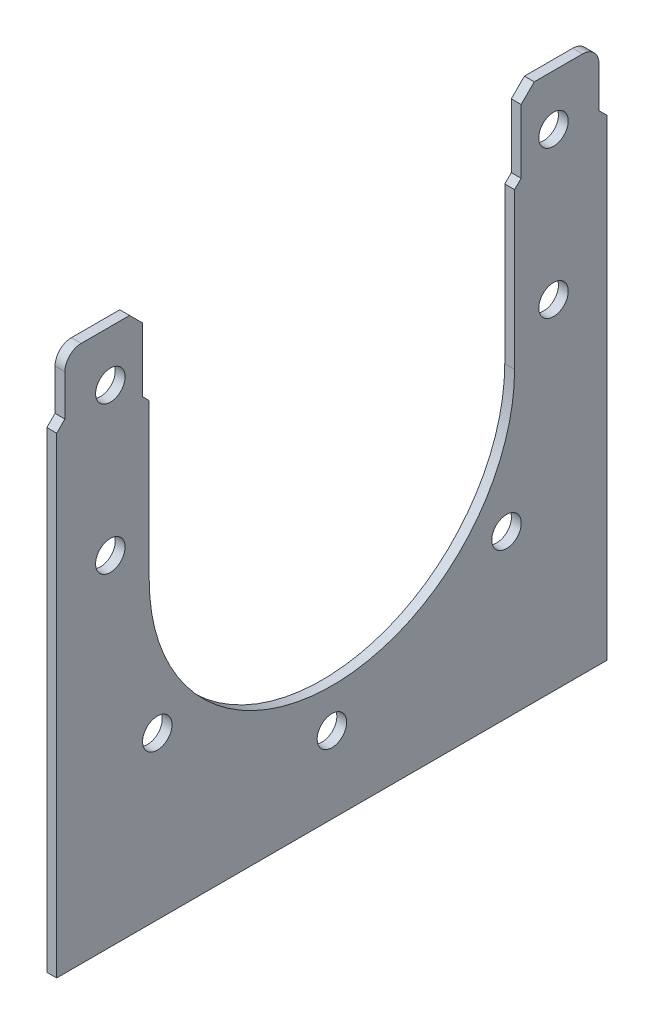
ISO-10303-21;
HEADER;
FILE_DESCRIPTION(('STEP AP214'),'2;1');
FILE_NAME('part.step','',(''),(''),'','','');
FILE_SCHEMA(('AUTOMOTIVE_DESIGN { 1 0 10303 214 1 1 1 1 }'));
ENDSEC;
DATA;
#1=APPLICATION_CONTEXT('core data for automotive mechanical design processes');
#2=APPLICATION_PROTOCOL_DEFINITION('international standard','automotive_design',2000,#1);
#3=PRODUCT_CONTEXT('',#1,'mechanical');
#4=PRODUCT('Part','Part','',(#3));
#5=PRODUCT_RELATED_PRODUCT_CATEGORY('part','',(#4));
#6=PRODUCT_DEFINITION_FORMATION('','',#4);
#7=PRODUCT_DEFINITION_CONTEXT('part definition',#1,'design');
#8=PRODUCT_DEFINITION('design','',#6,#7);
#9=PRODUCT_DEFINITION_SHAPE('','',#8);
#10=(LENGTH_UNIT() NAMED_UNIT(*) SI_UNIT(.MILLI.,.METRE.));
#11=(NAMED_UNIT(*) PLANE_ANGLE_UNIT() SI_UNIT($,.RADIAN.));
#12=(NAMED_UNIT(*) SI_UNIT($,.STERADIAN.) SOLID_ANGLE_UNIT());
#13=UNCERTAINTY_MEASURE_WITH_UNIT(LENGTH_MEASURE(1.E-05),#10,'distance_accuracy_value','');
#14=(GEOMETRIC_REPRESENTATION_CONTEXT(3) GLOBAL_UNCERTAINTY_ASSIGNED_CONTEXT((#13)) GLOBAL_UNIT_ASSIGNED_CONTEXT((#10,
#11,#12)) REPRESENTATION_CONTEXT('',''));
#15=CARTESIAN_POINT('',(0.,0.,0.));
#16=DIRECTION('',(0.,0.,1.));
#17=DIRECTION('',(1.,0.,0.));
#18=AXIS2_PLACEMENT_3D('',#15,#16,#17);
#19=CARTESIAN_POINT('',(-3.,146.,168.));
#20=DIRECTION('',(0.,1.,0.));
#21=DIRECTION('',(0.,0.,1.));
#22=AXIS2_PLACEMENT_3D('',#19,#20,#21);
#23=PLANE('',#22);
#24=DIRECTION('',(0.,0.,1.));
#25=VECTOR('',#24,1.);
#26=CARTESIAN_POINT('',(3.,146.,168.));
#27=LINE('',#26,#25);
#28=CARTESIAN_POINT('',(3.,146.,123.5));
#29=VERTEX_POINT('',#28);
#30=CARTESIAN_POINT('',(3.,146.,153.));
#31=VERTEX_POINT('',#30);
#32=EDGE_CURVE('E335',#29,#31,#27,.T.);
#33=ORIENTED_EDGE('',*,*,#32,.F.);
#34=DIRECTION('',(-1.,0.,0.));
#35=VECTOR('',#34,1.);
#36=CARTESIAN_POINT('',(-3.,146.,123.5));
#37=LINE('',#36,#35);
#38=CARTESIAN_POINT('',(-3.,146.,123.5));
#39=VERTEX_POINT('',#38);
#40=EDGE_CURVE('E208',#29,#39,#37,.T.);
#41=ORIENTED_EDGE('',*,*,#40,.T.);
#42=DIRECTION('',(0.,0.,1.));
#43=VECTOR('',#42,1.);
#44=CARTESIAN_POINT('',(-3.,146.,168.));
#45=LINE('',#44,#43);
#46=CARTESIAN_POINT('',(-3.,146.,153.));
#47=VERTEX_POINT('',#46);
#48=EDGE_CURVE('E339',#39,#47,#45,.T.);
#49=ORIENTED_EDGE('',*,*,#48,.T.);
#50=DIRECTION('',(1.,0.,0.));
#51=VECTOR('',#50,1.);
#52=CARTESIAN_POINT('',(3.,146.,153.));
#53=LINE('',#52,#51);
#54=EDGE_CURVE('E426',#47,#31,#53,.T.);
#55=ORIENTED_EDGE('',*,*,#54,.T.);
#56=EDGE_LOOP('',(#33,#41,#49,#55));
#57=FACE_BOUND('',#56,.T.);
#58=ADVANCED_FACE('F53',(#57),#23,.T.);
#59=CARTESIAN_POINT('',(-3.,0.,111.5));
#60=DIRECTION('',(0.,0.,-1.));
#61=DIRECTION('',(-1.,0.,0.));
#62=AXIS2_PLACEMENT_3D('',#59,#60,#61);
#63=PLANE('',#62);
#64=DIRECTION('',(0.,1.,0.));
#65=VECTOR('',#64,1.);
#66=CARTESIAN_POINT('',(-3.,0.,111.5));
#67=LINE('',#66,#65);
#68=CARTESIAN_POINT('',(-3.,0.,111.5));
#69=VERTEX_POINT('',#68);
#70=CARTESIAN_POINT('',(-3.,95.,111.5));
#71=VERTEX_POINT('',#70);
#72=EDGE_CURVE('E364',#69,#71,#67,.T.);
#73=ORIENTED_EDGE('',*,*,#72,.T.);
#74=DIRECTION('',(1.,0.,0.));
#75=VECTOR('',#74,1.);
#76=CARTESIAN_POINT('',(3.,95.,111.5));
#77=LINE('',#76,#75);
#78=CARTESIAN_POINT('',(3.,95.,111.5));
#79=VERTEX_POINT('',#78);
#80=EDGE_CURVE('E11',#71,#79,#77,.T.);
#81=ORIENTED_EDGE('',*,*,#80,.T.);
#82=DIRECTION('',(0.,1.,0.));
#83=VECTOR('',#82,1.);
#84=CARTESIAN_POINT('',(3.,0.,111.5));
#85=LINE('',#84,#83);
#86=CARTESIAN_POINT('',(3.,0.,111.5));
#87=VERTEX_POINT('',#86);
#88=EDGE_CURVE('E202',#87,#79,#85,.T.);
#89=ORIENTED_EDGE('',*,*,#88,.F.);
#90=DIRECTION('',(1.,0.,0.));
#91=VECTOR('',#90,1.);
#92=CARTESIAN_POINT('',(-3.,0.,111.5));
#93=LINE('',#92,#91);
#94=EDGE_CURVE('E393',#69,#87,#93,.T.);
#95=ORIENTED_EDGE('',*,*,#94,.F.);
#96=EDGE_LOOP('',(#73,#81,#89,#95));
#97=FACE_BOUND('',#96,.T.);
#98=ADVANCED_FACE('F480',(#97),#63,.T.);
#99=CARTESIAN_POINT('',(-3.,0.,0.));
#100=DIRECTION('',(1.,0.,0.));
#101=DIRECTION('',(0.,0.,-1.));
#102=AXIS2_PLACEMENT_3D('',#99,#100,#101);
#103=CYLINDRICAL_SURFACE('',#102,111.5);
#104=CARTESIAN_POINT('',(3.,0.,0.));
#105=DIRECTION('',(-1.,0.,0.));
#106=DIRECTION('',(0.,0.,-1.));
#107=AXIS2_PLACEMENT_3D('',#104,#105,#106);
#108=CIRCLE('',#107,111.5);
#109=CARTESIAN_POINT('',(3.,0.,-111.5));
#110=VERTEX_POINT('',#109);
#111=EDGE_CURVE('E388',#110,#87,#108,.T.);
#112=ORIENTED_EDGE('',*,*,#111,.F.);
#113=DIRECTION('',(1.,0.,0.));
#114=VECTOR('',#113,1.);
#115=CARTESIAN_POINT('',(-3.,0.,-111.5));
#116=LINE('',#115,#114);
#117=CARTESIAN_POINT('',(-3.,0.,-111.5));
#118=VERTEX_POINT('',#117);
#119=EDGE_CURVE('E397',#118,#110,#116,.T.);
#120=ORIENTED_EDGE('',*,*,#119,.F.);
#121=CARTESIAN_POINT('',(-3.,0.,0.));
#122=DIRECTION('',(-1.,0.,0.));
#123=DIRECTION('',(0.,0.,-1.));
#124=AXIS2_PLACEMENT_3D('',#121,#122,#123);
#125=CIRCLE('',#124,111.5);
#126=EDGE_CURVE('E360',#118,#69,#125,.T.);
#127=ORIENTED_EDGE('',*,*,#126,.T.);
#128=ORIENTED_EDGE('',*,*,#94,.T.);
#129=EDGE_LOOP('',(#112,#120,#127,#128));
#130=FACE_BOUND('',#129,.T.);
#131=ADVANCED_FACE('F478',(#130),#103,.F.);
#132=CARTESIAN_POINT('',(-3.,0.,-111.5));
#133=DIRECTION('',(0.,0.,1.));
#134=DIRECTION('',(1.,0.,0.));
#135=AXIS2_PLACEMENT_3D('',#132,#133,#134);
#136=PLANE('',#135);
#137=DIRECTION('',(0.,-1.,0.));
#138=VECTOR('',#137,1.);
#139=CARTESIAN_POINT('',(3.,0.,-111.5));
#140=LINE('',#139,#138);
#141=CARTESIAN_POINT('',(3.,95.0000000000001,-111.5));
#142=VERTEX_POINT('',#141);
#143=EDGE_CURVE('E385',#142,#110,#140,.T.);
#144=ORIENTED_EDGE('',*,*,#143,.F.);
#145=DIRECTION('',(-1.,0.,0.));
#146=VECTOR('',#145,1.);
#147=CARTESIAN_POINT('',(-3.,95.0000000000001,-111.5));
#148=LINE('',#147,#146);
#149=CARTESIAN_POINT('',(-3.,95.0000000000001,-111.5));
#150=VERTEX_POINT('',#149);
#151=EDGE_CURVE('E78',#142,#150,#148,.T.);
#152=ORIENTED_EDGE('',*,*,#151,.T.);
#153=DIRECTION('',(0.,-1.,0.));
#154=VECTOR('',#153,1.);
#155=CARTESIAN_POINT('',(-3.,0.,-111.5));
#156=LINE('',#155,#154);
#157=EDGE_CURVE('E357',#150,#118,#156,.T.);
#158=ORIENTED_EDGE('',*,*,#157,.T.);
#159=ORIENTED_EDGE('',*,*,#119,.T.);
#160=EDGE_LOOP('',(#144,#152,#158,#159));
#161=FACE_BOUND('',#160,.T.);
#162=ADVANCED_FACE('F474',(#161),#136,.T.);
#163=CARTESIAN_POINT('',(-3.,146.,-111.5));
#164=DIRECTION('',(0.,1.,0.));
#165=DIRECTION('',(0.,0.,1.));
#166=AXIS2_PLACEMENT_3D('',#163,#164,#165);
#167=PLANE('',#166);
#168=DIRECTION('',(0.,0.,1.));
#169=VECTOR('',#168,1.);
#170=CARTESIAN_POINT('',(-3.,146.,-111.5));
#171=LINE('',#170,#169);
#172=CARTESIAN_POINT('',(-3.,146.,-153.));
#173=VERTEX_POINT('',#172);
#174=CARTESIAN_POINT('',(-3.,146.,-123.5));
#175=VERTEX_POINT('',#174);
#176=EDGE_CURVE('E353',#173,#175,#171,.T.);
#177=ORIENTED_EDGE('',*,*,#176,.T.);
#178=DIRECTION('',(1.,0.,0.));
#179=VECTOR('',#178,1.);
#180=CARTESIAN_POINT('',(3.,146.,-123.5));
#181=LINE('',#180,#179);
#182=CARTESIAN_POINT('',(3.,146.,-123.5));
#183=VERTEX_POINT('',#182);
#184=EDGE_CURVE('E433',#175,#183,#181,.T.);
#185=ORIENTED_EDGE('',*,*,#184,.T.);
#186=DIRECTION('',(0.,0.,1.));
#187=VECTOR('',#186,1.);
#188=CARTESIAN_POINT('',(3.,146.,-111.5));
#189=LINE('',#188,#187);
#190=CARTESIAN_POINT('',(3.,146.,-153.));
#191=VERTEX_POINT('',#190);
#192=EDGE_CURVE('E381',#191,#183,#189,.T.);
#193=ORIENTED_EDGE('',*,*,#192,.F.);
#194=DIRECTION('',(1.,0.,0.));
#195=VECTOR('',#194,1.);
#196=CARTESIAN_POINT('',(-3.,146.,-153.));
#197=LINE('',#196,#195);
#198=EDGE_CURVE('E416',#191,#173,#197,.F.);
#199=ORIENTED_EDGE('',*,*,#198,.T.);
#200=EDGE_LOOP('',(#177,#185,#193,#199));
#201=FACE_BOUND('',#200,.T.);
#202=ADVANCED_FACE('F496',(#201),#167,.T.);
#203=CARTESIAN_POINT('',(-3.,146.,-168.));
#204=DIRECTION('',(0.,0.,-1.));
#205=DIRECTION('',(0.,1.,0.));
#206=AXIS2_PLACEMENT_3D('',#203,#204,#205);
#207=PLANE('',#206);
#208=DIRECTION('',(1.,0.,0.));
#209=VECTOR('',#208,1.);
#210=CARTESIAN_POINT('',(-3.,106.,-168.));
#211=LINE('',#210,#209);
#212=CARTESIAN_POINT('',(-3.,106.,-168.));
#213=VERTEX_POINT('',#212);
#214=CARTESIAN_POINT('',(3.,106.,-168.));
#215=VERTEX_POINT('',#214);
#216=EDGE_CURVE('E223',#213,#215,#211,.T.);
#217=ORIENTED_EDGE('',*,*,#216,.T.);
#218=DIRECTION('',(0.,1.,0.));
#219=VECTOR('',#218,1.);
#220=CARTESIAN_POINT('',(3.,146.,-168.));
#221=LINE('',#220,#219);
#222=CARTESIAN_POINT('',(3.,-182.,-168.));
#223=VERTEX_POINT('',#222);
#224=EDGE_CURVE('E377',#223,#215,#221,.T.);
#225=ORIENTED_EDGE('',*,*,#224,.F.);
#226=DIRECTION('',(1.,0.,0.));
#227=VECTOR('',#226,1.);
#228=CARTESIAN_POINT('',(-3.,-182.,-168.));
#229=LINE('',#228,#227);
#230=CARTESIAN_POINT('',(-3.,-182.,-168.));
#231=VERTEX_POINT('',#230);
#232=EDGE_CURVE('E401',#231,#223,#229,.T.);
#233=ORIENTED_EDGE('',*,*,#232,.F.);
#234=DIRECTION('',(0.,1.,0.));
#235=VECTOR('',#234,1.);
#236=CARTESIAN_POINT('',(-3.,146.,-168.));
#237=LINE('',#236,#235);
#238=EDGE_CURVE('E349',#231,#213,#237,.T.);
#239=ORIENTED_EDGE('',*,*,#238,.T.);
#240=EDGE_LOOP('',(#217,#225,#233,#239));
#241=FACE_BOUND('',#240,.T.);
#242=ADVANCED_FACE('F499',(#241),#207,.T.);
#243=CARTESIAN_POINT('',(-3.,-182.,168.));
#244=DIRECTION('',(0.,-1.,0.));
#245=DIRECTION('',(0.,0.,-1.));
#246=AXIS2_PLACEMENT_3D('',#243,#244,#245);
#247=PLANE('',#246);
#248=DIRECTION('',(0.,0.,-1.));
#249=VECTOR('',#248,1.);
#250=CARTESIAN_POINT('',(3.,-182.,168.));
#251=LINE('',#250,#249);
#252=CARTESIAN_POINT('',(3.,-182.,168.));
#253=VERTEX_POINT('',#252);
#254=EDGE_CURVE('E373',#253,#223,#251,.T.);
#255=ORIENTED_EDGE('',*,*,#254,.F.);
#256=DIRECTION('',(1.,0.,0.));
#257=VECTOR('',#256,1.);
#258=CARTESIAN_POINT('',(-3.,-182.,168.));
#259=LINE('',#258,#257);
#260=CARTESIAN_POINT('',(-3.,-182.,168.));
#261=VERTEX_POINT('',#260);
#262=EDGE_CURVE('E367',#261,#253,#259,.T.);
#263=ORIENTED_EDGE('',*,*,#262,.F.);
#264=DIRECTION('',(0.,0.,-1.));
#265=VECTOR('',#264,1.);
#266=CARTESIAN_POINT('',(-3.,-182.,168.));
#267=LINE('',#266,#265);
#268=EDGE_CURVE('E345',#261,#231,#267,.T.);
#269=ORIENTED_EDGE('',*,*,#268,.T.);
#270=ORIENTED_EDGE('',*,*,#232,.T.);
#271=EDGE_LOOP('',(#255,#263,#269,#270));
#272=FACE_BOUND('',#271,.T.);
#273=ADVANCED_FACE('F503',(#272),#247,.T.);
#274=CARTESIAN_POINT('',(-3.,146.,168.));
#275=DIRECTION('',(0.,0.,1.));
#276=DIRECTION('',(0.,-1.,0.));
#277=AXIS2_PLACEMENT_3D('',#274,#275,#276);
#278=PLANE('',#277);
#279=DIRECTION('',(1.,0.,0.));
#280=VECTOR('',#279,1.);
#281=CARTESIAN_POINT('',(-3.,106.,168.));
#282=LINE('',#281,#280);
#283=CARTESIAN_POINT('',(-3.,106.,168.));
#284=VERTEX_POINT('',#283);
#285=CARTESIAN_POINT('',(3.,106.,168.));
#286=VERTEX_POINT('',#285);
#287=EDGE_CURVE('E261',#284,#286,#282,.T.);
#288=ORIENTED_EDGE('',*,*,#287,.F.);
#289=DIRECTION('',(0.,-1.,0.));
#290=VECTOR('',#289,1.);
#291=CARTESIAN_POINT('',(-3.,146.,168.));
#292=LINE('',#291,#290);
#293=EDGE_CURVE('E342',#284,#261,#292,.T.);
#294=ORIENTED_EDGE('',*,*,#293,.T.);
#295=ORIENTED_EDGE('',*,*,#262,.T.);
#296=DIRECTION('',(0.,-1.,0.));
#297=VECTOR('',#296,1.);
#298=CARTESIAN_POINT('',(3.,146.,168.));
#299=LINE('',#298,#297);
#300=EDGE_CURVE('E370',#286,#253,#299,.T.);
#301=ORIENTED_EDGE('',*,*,#300,.F.);
#302=EDGE_LOOP('',(#288,#294,#295,#301));
#303=FACE_BOUND('',#302,.T.);
#304=ADVANCED_FACE('F507',(#303),#278,.T.);
#305=CARTESIAN_POINT('',(-3.,0.,0.));
#306=DIRECTION('',(1.,0.,0.));
#307=DIRECTION('',(0.,0.,-1.));
#308=AXIS2_PLACEMENT_3D('',#305,#306,#307);
#309=PLANE('',#308);
#310=CARTESIAN_POINT('',(-3.,-83.2682145377947,-106.57845442531));
#311=DIRECTION('',(1.,0.,0.));
#312=DIRECTION('',(0.,0.,-1.));
#313=AXIS2_PLACEMENT_3D('',#310,#311,#312);
#314=CIRCLE('',#313,8.99999999999999);
#315=CARTESIAN_POINT('',(-3.,-83.2682145377947,-115.57845442531));
#316=VERTEX_POINT('',#315);
#317=EDGE_CURVE('E320',#316,#316,#314,.T.);
#318=ORIENTED_EDGE('',*,*,#317,.T.);
#319=EDGE_LOOP('',(#318));
#320=FACE_BOUND('',#319,.T.);
#321=CARTESIAN_POINT('',(-3.,115.,-135.25));
#322=DIRECTION('',(1.,0.,0.));
#323=DIRECTION('',(0.,0.,-1.));
#324=AXIS2_PLACEMENT_3D('',#321,#322,#323);
#325=CIRCLE('',#324,9.00000000000001);
#326=CARTESIAN_POINT('',(-3.,115.,-144.25));
#327=VERTEX_POINT('',#326);
#328=EDGE_CURVE('E313',#327,#327,#325,.T.);
#329=ORIENTED_EDGE('',*,*,#328,.T.);
#330=EDGE_LOOP('',(#329));
#331=FACE_BOUND('',#330,.T.);
#332=CARTESIAN_POINT('',(-3.,25.,-135.25));
#333=DIRECTION('',(1.,0.,0.));
#334=DIRECTION('',(0.,0.,-1.));
#335=AXIS2_PLACEMENT_3D('',#332,#333,#334);
#336=CIRCLE('',#335,9.00000000000001);
#337=CARTESIAN_POINT('',(-3.,25.,-144.25));
#338=VERTEX_POINT('',#337);
#339=EDGE_CURVE('E265',#338,#338,#336,.T.);
#340=ORIENTED_EDGE('',*,*,#339,.T.);
#341=EDGE_LOOP('',(#340));
#342=FACE_BOUND('',#341,.T.);
#343=CARTESIAN_POINT('',(-3.,-83.2682145377947,106.57845442531));
#344=DIRECTION('',(1.,0.,0.));
#345=DIRECTION('',(0.,0.,-1.));
#346=AXIS2_PLACEMENT_3D('',#343,#344,#345);
#347=CIRCLE('',#346,8.99999999999999);
#348=CARTESIAN_POINT('',(-3.,-83.2682145377947,97.5784544253096));
#349=VERTEX_POINT('',#348);
#350=EDGE_CURVE('E304',#349,#349,#347,.T.);
#351=ORIENTED_EDGE('',*,*,#350,.T.);
#352=EDGE_LOOP('',(#351));
#353=FACE_BOUND('',#352,.T.);
#354=CARTESIAN_POINT('',(-3.,-135.25,0.));
#355=DIRECTION('',(1.,0.,0.));
#356=DIRECTION('',(0.,0.,-1.));
#357=AXIS2_PLACEMENT_3D('',#354,#355,#356);
#358=CIRCLE('',#357,9.00000000000001);
#359=CARTESIAN_POINT('',(-3.,-135.25,-9.00000000000001));
#360=VERTEX_POINT('',#359);
#361=EDGE_CURVE('E296',#360,#360,#358,.T.);
#362=ORIENTED_EDGE('',*,*,#361,.T.);
#363=EDGE_LOOP('',(#362));
#364=FACE_BOUND('',#363,.T.);
#365=CARTESIAN_POINT('',(-3.,115.,135.25));
#366=DIRECTION('',(1.,0.,0.));
#367=DIRECTION('',(0.,0.,-1.));
#368=AXIS2_PLACEMENT_3D('',#365,#366,#367);
#369=CIRCLE('',#368,9.00000000000001);
#370=CARTESIAN_POINT('',(-3.,115.,126.25));
#371=VERTEX_POINT('',#370);
#372=EDGE_CURVE('E288',#371,#371,#369,.T.);
#373=ORIENTED_EDGE('',*,*,#372,.T.);
#374=EDGE_LOOP('',(#373));
#375=FACE_BOUND('',#374,.T.);
#376=CARTESIAN_POINT('',(-3.,25.,135.25));
#377=DIRECTION('',(1.,0.,0.));
#378=DIRECTION('',(0.,0.,-1.));
#379=AXIS2_PLACEMENT_3D('',#376,#377,#378);
#380=CIRCLE('',#379,9.00000000000001);
#381=CARTESIAN_POINT('',(-3.,25.,126.25));
#382=VERTEX_POINT('',#381);
#383=EDGE_CURVE('E331',#382,#382,#380,.T.);
#384=ORIENTED_EDGE('',*,*,#383,.T.);
#385=EDGE_LOOP('',(#384));
#386=FACE_BOUND('',#385,.T.);
#387=ORIENTED_EDGE('',*,*,#157,.F.);
#388=DIRECTION('',(0.,0.707106781186548,-0.707106781186548));
#389=VECTOR('',#388,1.);
#390=CARTESIAN_POINT('',(-3.,99.,-115.5));
#391=LINE('',#390,#389);
#392=CARTESIAN_POINT('',(-3.,99.,-115.5));
#393=VERTEX_POINT('',#392);
#394=EDGE_CURVE('E63',#150,#393,#391,.T.);
#395=ORIENTED_EDGE('',*,*,#394,.T.);
#396=DIRECTION('',(0.,1.,0.));
#397=VECTOR('',#396,1.);
#398=CARTESIAN_POINT('',(-3.,146.,-115.5));
#399=LINE('',#398,#397);
#400=CARTESIAN_POINT('',(-3.,138.,-115.5));
#401=VERTEX_POINT('',#400);
#402=EDGE_CURVE('E237',#393,#401,#399,.T.);
#403=ORIENTED_EDGE('',*,*,#402,.T.);
#404=DIRECTION('',(0.,0.707106781186548,-0.707106781186548));
#405=VECTOR('',#404,1.);
#406=CARTESIAN_POINT('',(-3.,146.,-123.5));
#407=LINE('',#406,#405);
#408=EDGE_CURVE('E449',#401,#175,#407,.T.);
#409=ORIENTED_EDGE('',*,*,#408,.T.);
#410=ORIENTED_EDGE('',*,*,#176,.F.);
#411=CARTESIAN_POINT('',(-3.,136.,-153.));
#412=DIRECTION('',(1.,0.,0.));
#413=DIRECTION('',(0.,0.,-1.));
#414=AXIS2_PLACEMENT_3D('',#411,#412,#413);
#415=CIRCLE('',#414,10.);
#416=CARTESIAN_POINT('',(-3.,136.,-163.));
#417=VERTEX_POINT('',#416);
#418=EDGE_CURVE('E423',#173,#417,#415,.F.);
#419=ORIENTED_EDGE('',*,*,#418,.T.);
#420=DIRECTION('',(0.,-1.,0.));
#421=VECTOR('',#420,1.);
#422=CARTESIAN_POINT('',(-3.,146.,-163.));
#423=LINE('',#422,#421);
#424=CARTESIAN_POINT('',(-3.,111.,-163.));
#425=VERTEX_POINT('',#424);
#426=EDGE_CURVE('E275',#417,#425,#423,.T.);
#427=ORIENTED_EDGE('',*,*,#426,.T.);
#428=DIRECTION('',(0.,-0.707106781186543,-0.707106781186551));
#429=VECTOR('',#428,1.);
#430=CARTESIAN_POINT('',(-3.,111.,-163.));
#431=LINE('',#430,#429);
#432=EDGE_CURVE('E270',#425,#213,#431,.T.);
#433=ORIENTED_EDGE('',*,*,#432,.T.);
#434=ORIENTED_EDGE('',*,*,#238,.F.);
#435=ORIENTED_EDGE('',*,*,#268,.F.);
#436=ORIENTED_EDGE('',*,*,#293,.F.);
#437=DIRECTION('',(0.,0.707106781186547,-0.707106781186547));
#438=VECTOR('',#437,1.);
#439=CARTESIAN_POINT('',(-3.,111.,163.));
#440=LINE('',#439,#438);
#441=CARTESIAN_POINT('',(-3.,111.,163.));
#442=VERTEX_POINT('',#441);
#443=EDGE_CURVE('E253',#284,#442,#440,.T.);
#444=ORIENTED_EDGE('',*,*,#443,.T.);
#445=DIRECTION('',(0.,1.,0.));
#446=VECTOR('',#445,1.);
#447=CARTESIAN_POINT('',(-3.,146.,163.));
#448=LINE('',#447,#446);
#449=CARTESIAN_POINT('',(-3.,136.,163.));
#450=VERTEX_POINT('',#449);
#451=EDGE_CURVE('E257',#442,#450,#448,.T.);
#452=ORIENTED_EDGE('',*,*,#451,.T.);
#453=CARTESIAN_POINT('',(-3.,136.,153.));
#454=DIRECTION('',(1.,0.,0.));
#455=DIRECTION('',(0.,0.,-1.));
#456=AXIS2_PLACEMENT_3D('',#453,#454,#455);
#457=CIRCLE('',#456,10.);
#458=EDGE_CURVE('E419',#450,#47,#457,.F.);
#459=ORIENTED_EDGE('',*,*,#458,.T.);
#460=ORIENTED_EDGE('',*,*,#48,.F.);
#461=DIRECTION('',(0.,-0.707106781186548,-0.707106781186548));
#462=VECTOR('',#461,1.);
#463=CARTESIAN_POINT('',(-3.,138.,115.5));
#464=LINE('',#463,#462);
#465=CARTESIAN_POINT('',(-3.,138.,115.5));
#466=VERTEX_POINT('',#465);
#467=EDGE_CURVE('E446',#39,#466,#464,.T.);
#468=ORIENTED_EDGE('',*,*,#467,.T.);
#469=DIRECTION('',(0.,-1.,0.));
#470=VECTOR('',#469,1.);
#471=CARTESIAN_POINT('',(-3.,146.,115.5));
#472=LINE('',#471,#470);
#473=CARTESIAN_POINT('',(-3.,99.,115.5));
#474=VERTEX_POINT('',#473);
#475=EDGE_CURVE('E219',#466,#474,#472,.T.);
#476=ORIENTED_EDGE('',*,*,#475,.T.);
#477=DIRECTION('',(0.,-0.707106781186548,-0.707106781186548));
#478=VECTOR('',#477,1.);
#479=CARTESIAN_POINT('',(-3.,95.,111.5));
#480=LINE('',#479,#478);
#481=EDGE_CURVE('E70',#474,#71,#480,.T.);
#482=ORIENTED_EDGE('',*,*,#481,.T.);
#483=ORIENTED_EDGE('',*,*,#72,.F.);
#484=ORIENTED_EDGE('',*,*,#126,.F.);
#485=EDGE_LOOP('',(#387,#395,#403,#409,#410,#419,#427,#433,#434,#435,#436,#444,#452,#459,#460,
#468,#476,#482,#483,#484));
#486=FACE_BOUND('',#485,.T.);
#487=ADVANCED_FACE('F465',(#320,#331,#342,#353,#364,#375,#386,#486),#309,.F.);
#488=CARTESIAN_POINT('',(3.,0.,0.));
#489=DIRECTION('',(1.,0.,0.));
#490=DIRECTION('',(0.,0.,-1.));
#491=AXIS2_PLACEMENT_3D('',#488,#489,#490);
#492=PLANE('',#491);
#493=DIRECTION('',(0.,1.,0.));
#494=VECTOR('',#493,1.);
#495=CARTESIAN_POINT('',(3.,146.,-115.5));
#496=LINE('',#495,#494);
#497=CARTESIAN_POINT('',(3.,99.,-115.5));
#498=VERTEX_POINT('',#497);
#499=CARTESIAN_POINT('',(3.,138.,-115.5));
#500=VERTEX_POINT('',#499);
#501=EDGE_CURVE('E220',#498,#500,#496,.T.);
#502=ORIENTED_EDGE('',*,*,#501,.F.);
#503=DIRECTION('',(0.,-0.707106781186548,0.707106781186548));
#504=VECTOR('',#503,1.);
#505=CARTESIAN_POINT('',(3.,-8.24999999999997,-8.24999999999997));
#506=LINE('',#505,#504);
#507=EDGE_CURVE('E207',#498,#142,#506,.T.);
#508=ORIENTED_EDGE('',*,*,#507,.T.);
#509=ORIENTED_EDGE('',*,*,#143,.T.);
#510=ORIENTED_EDGE('',*,*,#111,.T.);
#511=ORIENTED_EDGE('',*,*,#88,.T.);
#512=DIRECTION('',(0.,0.707106781186548,0.707106781186548));
#513=VECTOR('',#512,1.);
#514=CARTESIAN_POINT('',(3.,-8.24999999999998,8.24999999999998));
#515=LINE('',#514,#513);
#516=CARTESIAN_POINT('',(3.,99.,115.5));
#517=VERTEX_POINT('',#516);
#518=EDGE_CURVE('E194',#79,#517,#515,.T.);
#519=ORIENTED_EDGE('',*,*,#518,.T.);
#520=DIRECTION('',(0.,-1.,0.));
#521=VECTOR('',#520,1.);
#522=CARTESIAN_POINT('',(3.,146.,115.5));
#523=LINE('',#522,#521);
#524=CARTESIAN_POINT('',(3.,138.,115.5));
#525=VERTEX_POINT('',#524);
#526=EDGE_CURVE('E199',#525,#517,#523,.T.);
#527=ORIENTED_EDGE('',*,*,#526,.F.);
#528=DIRECTION('',(0.,0.707106781186548,0.707106781186548));
#529=VECTOR('',#528,1.);
#530=CARTESIAN_POINT('',(3.,11.25,-11.25));
#531=LINE('',#530,#529);
#532=EDGE_CURVE('E437',#525,#29,#531,.T.);
#533=ORIENTED_EDGE('',*,*,#532,.T.);
#534=ORIENTED_EDGE('',*,*,#32,.T.);
#535=CARTESIAN_POINT('',(3.,136.,153.));
#536=DIRECTION('',(1.,0.,0.));
#537=DIRECTION('',(0.,0.,-1.));
#538=AXIS2_PLACEMENT_3D('',#535,#536,#537);
#539=CIRCLE('',#538,10.);
#540=CARTESIAN_POINT('',(3.,136.,163.));
#541=VERTEX_POINT('',#540);
#542=EDGE_CURVE('E410',#31,#541,#539,.T.);
#543=ORIENTED_EDGE('',*,*,#542,.T.);
#544=DIRECTION('',(0.,1.,0.));
#545=VECTOR('',#544,1.);
#546=CARTESIAN_POINT('',(3.,146.,163.));
#547=LINE('',#546,#545);
#548=CARTESIAN_POINT('',(3.,111.,163.));
#549=VERTEX_POINT('',#548);
#550=EDGE_CURVE('E248',#549,#541,#547,.T.);
#551=ORIENTED_EDGE('',*,*,#550,.F.);
#552=DIRECTION('',(0.,0.707106781186547,-0.707106781186547));
#553=VECTOR('',#552,1.);
#554=CARTESIAN_POINT('',(3.,111.,163.));
#555=LINE('',#554,#553);
#556=EDGE_CURVE('E244',#286,#549,#555,.T.);
#557=ORIENTED_EDGE('',*,*,#556,.F.);
#558=ORIENTED_EDGE('',*,*,#300,.T.);
#559=ORIENTED_EDGE('',*,*,#254,.T.);
#560=ORIENTED_EDGE('',*,*,#224,.T.);
#561=DIRECTION('',(0.,-0.707106781186543,-0.707106781186551));
#562=VECTOR('',#561,1.);
#563=CARTESIAN_POINT('',(3.,111.,-163.));
#564=LINE('',#563,#562);
#565=CARTESIAN_POINT('',(3.,111.,-163.));
#566=VERTEX_POINT('',#565);
#567=EDGE_CURVE('E278',#566,#215,#564,.T.);
#568=ORIENTED_EDGE('',*,*,#567,.F.);
#569=DIRECTION('',(0.,-1.,0.));
#570=VECTOR('',#569,1.);
#571=CARTESIAN_POINT('',(3.,146.,-163.));
#572=LINE('',#571,#570);
#573=CARTESIAN_POINT('',(3.,136.,-163.));
#574=VERTEX_POINT('',#573);
#575=EDGE_CURVE('E249',#574,#566,#572,.T.);
#576=ORIENTED_EDGE('',*,*,#575,.F.);
#577=CARTESIAN_POINT('',(3.,136.,-153.));
#578=DIRECTION('',(1.,0.,0.));
#579=DIRECTION('',(0.,0.,-1.));
#580=AXIS2_PLACEMENT_3D('',#577,#578,#579);
#581=CIRCLE('',#580,10.);
#582=EDGE_CURVE('E413',#574,#191,#581,.T.);
#583=ORIENTED_EDGE('',*,*,#582,.T.);
#584=ORIENTED_EDGE('',*,*,#192,.T.);
#585=DIRECTION('',(0.,-0.707106781186548,0.707106781186548));
#586=VECTOR('',#585,1.);
#587=CARTESIAN_POINT('',(3.,11.25,11.25));
#588=LINE('',#587,#586);
#589=EDGE_CURVE('E440',#183,#500,#588,.T.);
#590=ORIENTED_EDGE('',*,*,#589,.T.);
#591=EDGE_LOOP('',(#502,#508,#509,#510,#511,#519,#527,#533,#534,#543,#551,#557,#558,#559,#560,
#568,#576,#583,#584,#590));
#592=FACE_BOUND('',#591,.T.);
#593=CARTESIAN_POINT('',(3.,-83.2682145377947,-106.57845442531));
#594=DIRECTION('',(1.,0.,0.));
#595=DIRECTION('',(0.,0.,-1.));
#596=AXIS2_PLACEMENT_3D('',#593,#594,#595);
#597=CIRCLE('',#596,8.99999999999999);
#598=CARTESIAN_POINT('',(3.,-83.2682145377947,-115.57845442531));
#599=VERTEX_POINT('',#598);
#600=EDGE_CURVE('E308',#599,#599,#597,.T.);
#601=ORIENTED_EDGE('',*,*,#600,.F.);
#602=EDGE_LOOP('',(#601));
#603=FACE_BOUND('',#602,.T.);
#604=CARTESIAN_POINT('',(3.,115.,-135.25));
#605=DIRECTION('',(1.,0.,0.));
#606=DIRECTION('',(0.,0.,-1.));
#607=AXIS2_PLACEMENT_3D('',#604,#605,#606);
#608=CIRCLE('',#607,9.00000000000001);
#609=CARTESIAN_POINT('',(3.,115.,-144.25));
#610=VERTEX_POINT('',#609);
#611=EDGE_CURVE('E324',#610,#610,#608,.T.);
#612=ORIENTED_EDGE('',*,*,#611,.F.);
#613=EDGE_LOOP('',(#612));
#614=FACE_BOUND('',#613,.T.);
#615=CARTESIAN_POINT('',(3.,25.,-135.25));
#616=DIRECTION('',(1.,0.,0.));
#617=DIRECTION('',(0.,0.,-1.));
#618=AXIS2_PLACEMENT_3D('',#615,#616,#617);
#619=CIRCLE('',#618,9.00000000000001);
#620=CARTESIAN_POINT('',(3.,25.,-144.25));
#621=VERTEX_POINT('',#620);
#622=EDGE_CURVE('E309',#621,#621,#619,.T.);
#623=ORIENTED_EDGE('',*,*,#622,.F.);
#624=EDGE_LOOP('',(#623));
#625=FACE_BOUND('',#624,.T.);
#626=CARTESIAN_POINT('',(3.,-83.2682145377947,106.57845442531));
#627=DIRECTION('',(1.,0.,0.));
#628=DIRECTION('',(0.,0.,-1.));
#629=AXIS2_PLACEMENT_3D('',#626,#627,#628);
#630=CIRCLE('',#629,8.99999999999999);
#631=CARTESIAN_POINT('',(3.,-83.2682145377947,97.5784544253096));
#632=VERTEX_POINT('',#631);
#633=EDGE_CURVE('E300',#632,#632,#630,.T.);
#634=ORIENTED_EDGE('',*,*,#633,.F.);
#635=EDGE_LOOP('',(#634));
#636=FACE_BOUND('',#635,.T.);
#637=CARTESIAN_POINT('',(3.,-135.25,0.));
#638=DIRECTION('',(1.,0.,0.));
#639=DIRECTION('',(0.,0.,-1.));
#640=AXIS2_PLACEMENT_3D('',#637,#638,#639);
#641=CIRCLE('',#640,9.00000000000001);
#642=CARTESIAN_POINT('',(3.,-135.25,-9.00000000000001));
#643=VERTEX_POINT('',#642);
#644=EDGE_CURVE('E292',#643,#643,#641,.T.);
#645=ORIENTED_EDGE('',*,*,#644,.F.);
#646=EDGE_LOOP('',(#645));
#647=FACE_BOUND('',#646,.T.);
#648=CARTESIAN_POINT('',(3.,115.,135.25));
#649=DIRECTION('',(1.,0.,0.));
#650=DIRECTION('',(0.,0.,-1.));
#651=AXIS2_PLACEMENT_3D('',#648,#649,#650);
#652=CIRCLE('',#651,9.00000000000001);
#653=CARTESIAN_POINT('',(3.,115.,126.25));
#654=VERTEX_POINT('',#653);
#655=EDGE_CURVE('E283',#654,#654,#652,.T.);
#656=ORIENTED_EDGE('',*,*,#655,.F.);
#657=EDGE_LOOP('',(#656));
#658=FACE_BOUND('',#657,.T.);
#659=CARTESIAN_POINT('',(3.,25.,135.25));
#660=DIRECTION('',(1.,0.,0.));
#661=DIRECTION('',(0.,0.,-1.));
#662=AXIS2_PLACEMENT_3D('',#659,#660,#661);
#663=CIRCLE('',#662,9.00000000000001);
#664=CARTESIAN_POINT('',(3.,25.,126.25));
#665=VERTEX_POINT('',#664);
#666=EDGE_CURVE('E287',#665,#665,#663,.T.);
#667=ORIENTED_EDGE('',*,*,#666,.F.);
#668=EDGE_LOOP('',(#667));
#669=FACE_BOUND('',#668,.T.);
#670=ADVANCED_FACE('F197',(#592,#603,#614,#625,#636,#647,#658,#669),#492,.T.);
#671=CARTESIAN_POINT('',(-3.,25.,135.25));
#672=DIRECTION('',(1.,0.,0.));
#673=DIRECTION('',(0.,0.,-1.));
#674=AXIS2_PLACEMENT_3D('',#671,#672,#673);
#675=CYLINDRICAL_SURFACE('',#674,9.00000000000001);
#676=ORIENTED_EDGE('',*,*,#383,.F.);
#677=EDGE_LOOP('',(#676));
#678=FACE_BOUND('',#677,.T.);
#679=ORIENTED_EDGE('',*,*,#666,.T.);
#680=EDGE_LOOP('',(#679));
#681=FACE_BOUND('',#680,.T.);
#682=ADVANCED_FACE('F698',(#678,#681),#675,.F.);
#683=CARTESIAN_POINT('',(-3.,115.,135.25));
#684=DIRECTION('',(1.,0.,0.));
#685=DIRECTION('',(0.,0.,-1.));
#686=AXIS2_PLACEMENT_3D('',#683,#684,#685);
#687=CYLINDRICAL_SURFACE('',#686,9.00000000000001);
#688=ORIENTED_EDGE('',*,*,#372,.F.);
#689=EDGE_LOOP('',(#688));
#690=FACE_BOUND('',#689,.T.);
#691=ORIENTED_EDGE('',*,*,#655,.T.);
#692=EDGE_LOOP('',(#691));
#693=FACE_BOUND('',#692,.T.);
#694=ADVANCED_FACE('F687',(#690,#693),#687,.F.);
#695=CARTESIAN_POINT('',(-3.,-135.25,0.));
#696=DIRECTION('',(1.,0.,0.));
#697=DIRECTION('',(0.,0.,-1.));
#698=AXIS2_PLACEMENT_3D('',#695,#696,#697);
#699=CYLINDRICAL_SURFACE('',#698,9.00000000000001);
#700=ORIENTED_EDGE('',*,*,#361,.F.);
#701=EDGE_LOOP('',(#700));
#702=FACE_BOUND('',#701,.T.);
#703=ORIENTED_EDGE('',*,*,#644,.T.);
#704=EDGE_LOOP('',(#703));
#705=FACE_BOUND('',#704,.T.);
#706=ADVANCED_FACE('F676',(#702,#705),#699,.F.);
#707=CARTESIAN_POINT('',(-3.,-83.2682145377947,106.57845442531));
#708=DIRECTION('',(1.,0.,0.));
#709=DIRECTION('',(0.,0.,-1.));
#710=AXIS2_PLACEMENT_3D('',#707,#708,#709);
#711=CYLINDRICAL_SURFACE('',#710,8.99999999999999);
#712=ORIENTED_EDGE('',*,*,#350,.F.);
#713=EDGE_LOOP('',(#712));
#714=FACE_BOUND('',#713,.T.);
#715=ORIENTED_EDGE('',*,*,#633,.T.);
#716=EDGE_LOOP('',(#715));
#717=FACE_BOUND('',#716,.T.);
#718=ADVANCED_FACE('F665',(#714,#717),#711,.F.);
#719=CARTESIAN_POINT('',(-3.,25.,-135.25));
#720=DIRECTION('',(1.,0.,0.));
#721=DIRECTION('',(0.,0.,-1.));
#722=AXIS2_PLACEMENT_3D('',#719,#720,#721);
#723=CYLINDRICAL_SURFACE('',#722,9.00000000000001);
#724=ORIENTED_EDGE('',*,*,#339,.F.);
#725=EDGE_LOOP('',(#724));
#726=FACE_BOUND('',#725,.T.);
#727=ORIENTED_EDGE('',*,*,#622,.T.);
#728=EDGE_LOOP('',(#727));
#729=FACE_BOUND('',#728,.T.);
#730=ADVANCED_FACE('F654',(#726,#729),#723,.F.);
#731=CARTESIAN_POINT('',(-3.,115.,-135.25));
#732=DIRECTION('',(1.,0.,0.));
#733=DIRECTION('',(0.,0.,-1.));
#734=AXIS2_PLACEMENT_3D('',#731,#732,#733);
#735=CYLINDRICAL_SURFACE('',#734,9.00000000000001);
#736=ORIENTED_EDGE('',*,*,#328,.F.);
#737=EDGE_LOOP('',(#736));
#738=FACE_BOUND('',#737,.T.);
#739=ORIENTED_EDGE('',*,*,#611,.T.);
#740=EDGE_LOOP('',(#739));
#741=FACE_BOUND('',#740,.T.);
#742=ADVANCED_FACE('F643',(#738,#741),#735,.F.);
#743=CARTESIAN_POINT('',(-3.,-83.2682145377947,-106.57845442531));
#744=DIRECTION('',(1.,0.,0.));
#745=DIRECTION('',(0.,0.,-1.));
#746=AXIS2_PLACEMENT_3D('',#743,#744,#745);
#747=CYLINDRICAL_SURFACE('',#746,8.99999999999999);
#748=ORIENTED_EDGE('',*,*,#317,.F.);
#749=EDGE_LOOP('',(#748));
#750=FACE_BOUND('',#749,.T.);
#751=ORIENTED_EDGE('',*,*,#600,.T.);
#752=EDGE_LOOP('',(#751));
#753=FACE_BOUND('',#752,.T.);
#754=ADVANCED_FACE('F632',(#750,#753),#747,.F.);
#755=CARTESIAN_POINT('',(-3.,111.,-163.));
#756=DIRECTION('',(0.,-0.707106781186551,0.707106781186543));
#757=DIRECTION('',(0.,-0.707106781186544,-0.707106781186552));
#758=AXIS2_PLACEMENT_3D('',#755,#756,#757);
#759=PLANE('',#758);
#760=ORIENTED_EDGE('',*,*,#216,.F.);
#761=ORIENTED_EDGE('',*,*,#432,.F.);
#762=DIRECTION('',(1.,0.,0.));
#763=VECTOR('',#762,1.);
#764=CARTESIAN_POINT('',(-3.,111.,-163.));
#765=LINE('',#764,#763);
#766=EDGE_CURVE('E229',#425,#566,#765,.T.);
#767=ORIENTED_EDGE('',*,*,#766,.T.);
#768=ORIENTED_EDGE('',*,*,#567,.T.);
#769=EDGE_LOOP('',(#760,#761,#767,#768));
#770=FACE_BOUND('',#769,.T.);
#771=ADVANCED_FACE('F622',(#770),#759,.F.);
#772=CARTESIAN_POINT('',(-3.,146.,-163.));
#773=DIRECTION('',(0.,0.,1.));
#774=DIRECTION('',(1.,0.,0.));
#775=AXIS2_PLACEMENT_3D('',#772,#773,#774);
#776=PLANE('',#775);
#777=ORIENTED_EDGE('',*,*,#426,.F.);
#778=DIRECTION('',(1.,0.,0.));
#779=VECTOR('',#778,1.);
#780=CARTESIAN_POINT('',(3.,136.,-163.));
#781=LINE('',#780,#779);
#782=EDGE_CURVE('E396',#417,#574,#781,.T.);
#783=ORIENTED_EDGE('',*,*,#782,.T.);
#784=ORIENTED_EDGE('',*,*,#575,.T.);
#785=ORIENTED_EDGE('',*,*,#766,.F.);
#786=EDGE_LOOP('',(#777,#783,#784,#785));
#787=FACE_BOUND('',#786,.T.);
#788=ADVANCED_FACE('F612',(#787),#776,.F.);
#789=CARTESIAN_POINT('',(-3.,146.,163.));
#790=DIRECTION('',(0.,0.,-1.));
#791=DIRECTION('',(-1.,0.,0.));
#792=AXIS2_PLACEMENT_3D('',#789,#790,#791);
#793=PLANE('',#792);
#794=ORIENTED_EDGE('',*,*,#550,.T.);
#795=DIRECTION('',(1.,0.,0.));
#796=VECTOR('',#795,1.);
#797=CARTESIAN_POINT('',(-3.,136.,163.));
#798=LINE('',#797,#796);
#799=EDGE_CURVE('E430',#541,#450,#798,.F.);
#800=ORIENTED_EDGE('',*,*,#799,.T.);
#801=ORIENTED_EDGE('',*,*,#451,.F.);
#802=DIRECTION('',(1.,0.,0.));
#803=VECTOR('',#802,1.);
#804=CARTESIAN_POINT('',(-3.,111.,163.));
#805=LINE('',#804,#803);
#806=EDGE_CURVE('E262',#442,#549,#805,.T.);
#807=ORIENTED_EDGE('',*,*,#806,.T.);
#808=EDGE_LOOP('',(#794,#800,#801,#807));
#809=FACE_BOUND('',#808,.T.);
#810=ADVANCED_FACE('F600',(#809),#793,.F.);
#811=CARTESIAN_POINT('',(-3.,111.,163.));
#812=DIRECTION('',(0.,-0.707106781186548,-0.707106781186548));
#813=DIRECTION('',(0.,0.707106781186548,-0.707106781186548));
#814=AXIS2_PLACEMENT_3D('',#811,#812,#813);
#815=PLANE('',#814);
#816=ORIENTED_EDGE('',*,*,#806,.F.);
#817=ORIENTED_EDGE('',*,*,#443,.F.);
#818=ORIENTED_EDGE('',*,*,#287,.T.);
#819=ORIENTED_EDGE('',*,*,#556,.T.);
#820=EDGE_LOOP('',(#816,#817,#818,#819));
#821=FACE_BOUND('',#820,.T.);
#822=ADVANCED_FACE('F516',(#821),#815,.F.);
#823=CARTESIAN_POINT('',(-3.,136.,-153.));
#824=DIRECTION('',(-1.,0.,0.));
#825=DIRECTION('',(0.,0.,1.));
#826=AXIS2_PLACEMENT_3D('',#823,#824,#825);
#827=CYLINDRICAL_SURFACE('',#826,10.);
#828=ORIENTED_EDGE('',*,*,#418,.F.);
#829=ORIENTED_EDGE('',*,*,#198,.F.);
#830=ORIENTED_EDGE('',*,*,#582,.F.);
#831=ORIENTED_EDGE('',*,*,#782,.F.);
#832=EDGE_LOOP('',(#828,#829,#830,#831));
#833=FACE_BOUND('',#832,.T.);
#834=ADVANCED_FACE('F512',(#833),#827,.T.);
#835=CARTESIAN_POINT('',(-3.,136.,153.));
#836=DIRECTION('',(-1.,0.,0.));
#837=DIRECTION('',(0.,0.,1.));
#838=AXIS2_PLACEMENT_3D('',#835,#836,#837);
#839=CYLINDRICAL_SURFACE('',#838,10.);
#840=ORIENTED_EDGE('',*,*,#458,.F.);
#841=ORIENTED_EDGE('',*,*,#799,.F.);
#842=ORIENTED_EDGE('',*,*,#542,.F.);
#843=ORIENTED_EDGE('',*,*,#54,.F.);
#844=EDGE_LOOP('',(#840,#841,#842,#843));
#845=FACE_BOUND('',#844,.T.);
#846=ADVANCED_FACE('F515',(#845),#839,.T.);
#847=CARTESIAN_POINT('',(-3.,146.,-115.5));
#848=DIRECTION('',(0.,0.,-1.));
#849=DIRECTION('',(-1.,0.,0.));
#850=AXIS2_PLACEMENT_3D('',#847,#848,#849);
#851=PLANE('',#850);
#852=ORIENTED_EDGE('',*,*,#501,.T.);
#853=DIRECTION('',(-1.,0.,0.));
#854=VECTOR('',#853,1.);
#855=CARTESIAN_POINT('',(-3.,138.,-115.5));
#856=LINE('',#855,#854);
#857=EDGE_CURVE('E443',#500,#401,#856,.T.);
#858=ORIENTED_EDGE('',*,*,#857,.T.);
#859=ORIENTED_EDGE('',*,*,#402,.F.);
#860=DIRECTION('',(1.,0.,0.));
#861=VECTOR('',#860,1.);
#862=CARTESIAN_POINT('',(-3.,99.,-115.5));
#863=LINE('',#862,#861);
#864=EDGE_CURVE('E233',#393,#498,#863,.T.);
#865=ORIENTED_EDGE('',*,*,#864,.T.);
#866=EDGE_LOOP('',(#852,#858,#859,#865));
#867=FACE_BOUND('',#866,.T.);
#868=ADVANCED_FACE('F471',(#867),#851,.F.);
#869=CARTESIAN_POINT('',(-3.,146.,115.5));
#870=DIRECTION('',(0.,0.,1.));
#871=DIRECTION('',(1.,0.,0.));
#872=AXIS2_PLACEMENT_3D('',#869,#870,#871);
#873=PLANE('',#872);
#874=ORIENTED_EDGE('',*,*,#475,.F.);
#875=DIRECTION('',(1.,0.,0.));
#876=VECTOR('',#875,1.);
#877=CARTESIAN_POINT('',(3.,138.,115.5));
#878=LINE('',#877,#876);
#879=EDGE_CURVE('E217',#466,#525,#878,.T.);
#880=ORIENTED_EDGE('',*,*,#879,.T.);
#881=ORIENTED_EDGE('',*,*,#526,.T.);
#882=DIRECTION('',(1.,0.,0.));
#883=VECTOR('',#882,1.);
#884=CARTESIAN_POINT('',(-3.,99.,115.5));
#885=LINE('',#884,#883);
#886=EDGE_CURVE('E215',#474,#517,#885,.T.);
#887=ORIENTED_EDGE('',*,*,#886,.F.);
#888=EDGE_LOOP('',(#874,#880,#881,#887));
#889=FACE_BOUND('',#888,.T.);
#890=ADVANCED_FACE('F214',(#889),#873,.F.);
#891=CARTESIAN_POINT('',(-3.,146.,-123.5));
#892=DIRECTION('',(0.,0.707106781186547,0.707106781186547));
#893=DIRECTION('',(-1.,0.,0.));
#894=AXIS2_PLACEMENT_3D('',#891,#892,#893);
#895=PLANE('',#894);
#896=ORIENTED_EDGE('',*,*,#408,.F.);
#897=ORIENTED_EDGE('',*,*,#857,.F.);
#898=ORIENTED_EDGE('',*,*,#589,.F.);
#899=ORIENTED_EDGE('',*,*,#184,.F.);
#900=EDGE_LOOP('',(#896,#897,#898,#899));
#901=FACE_BOUND('',#900,.T.);
#902=ADVANCED_FACE('F522',(#901),#895,.T.);
#903=CARTESIAN_POINT('',(-3.,138.,115.5));
#904=DIRECTION('',(0.,0.707106781186547,-0.707106781186547));
#905=DIRECTION('',(-1.,0.,0.));
#906=AXIS2_PLACEMENT_3D('',#903,#904,#905);
#907=PLANE('',#906);
#908=ORIENTED_EDGE('',*,*,#467,.F.);
#909=ORIENTED_EDGE('',*,*,#40,.F.);
#910=ORIENTED_EDGE('',*,*,#532,.F.);
#911=ORIENTED_EDGE('',*,*,#879,.F.);
#912=EDGE_LOOP('',(#908,#909,#910,#911));
#913=FACE_BOUND('',#912,.T.);
#914=ADVANCED_FACE('F528',(#913),#907,.T.);
#915=CARTESIAN_POINT('',(-3.,99.,-115.5));
#916=DIRECTION('',(0.,0.707106781186547,0.707106781186547));
#917=DIRECTION('',(-1.,0.,0.));
#918=AXIS2_PLACEMENT_3D('',#915,#916,#917);
#919=PLANE('',#918);
#920=ORIENTED_EDGE('',*,*,#394,.F.);
#921=ORIENTED_EDGE('',*,*,#151,.F.);
#922=ORIENTED_EDGE('',*,*,#507,.F.);
#923=ORIENTED_EDGE('',*,*,#864,.F.);
#924=EDGE_LOOP('',(#920,#921,#922,#923));
#925=FACE_BOUND('',#924,.T.);
#926=ADVANCED_FACE('F473',(#925),#919,.T.);
#927=CARTESIAN_POINT('',(-3.,95.,111.5));
#928=DIRECTION('',(0.,0.707106781186547,-0.707106781186547));
#929=DIRECTION('',(-1.,0.,0.));
#930=AXIS2_PLACEMENT_3D('',#927,#928,#929);
#931=PLANE('',#930);
#932=ORIENTED_EDGE('',*,*,#481,.F.);
#933=ORIENTED_EDGE('',*,*,#886,.T.);
#934=ORIENTED_EDGE('',*,*,#518,.F.);
#935=ORIENTED_EDGE('',*,*,#80,.F.);
#936=EDGE_LOOP('',(#932,#933,#934,#935));
#937=FACE_BOUND('',#936,.T.);
#938=ADVANCED_FACE('F56',(#937),#931,.T.);
#939=CLOSED_SHELL('',(#58,#98,#131,#162,#202,#242,#273,#304,#487,#670,#682,#694,#706,#718,#730,
#742,#754,#771,#788,#810,#822,#834,#846,#868,#890,#902,#914,#926,#938));
#940=MANIFOLD_SOLID_BREP('B2',#939);
#941=ADVANCED_BREP_SHAPE_REPRESENTATION('',(#18,#940),#14);
#942=SHAPE_DEFINITION_REPRESENTATION(#9,#941);
ENDSEC;
END-ISO-10303-21;
